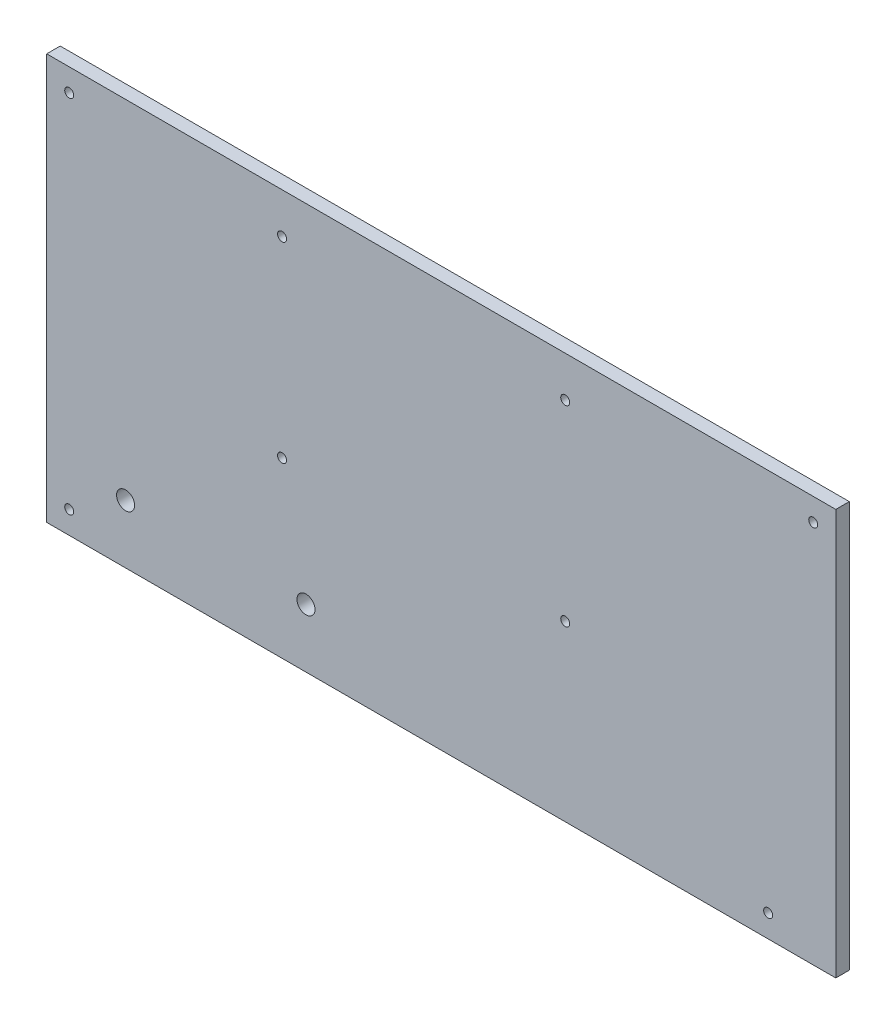
ISO-10303-21;
HEADER;
FILE_DESCRIPTION(('STEP AP214'),'2;1');
FILE_NAME('part.step','',(''),(''),'','','');
FILE_SCHEMA(('AUTOMOTIVE_DESIGN { 1 0 10303 214 1 1 1 1 }'));
ENDSEC;
DATA;
#1=APPLICATION_CONTEXT('core data for automotive mechanical design processes');
#2=APPLICATION_PROTOCOL_DEFINITION('international standard','automotive_design',2000,#1);
#3=PRODUCT_CONTEXT('',#1,'mechanical');
#4=PRODUCT('Part','Part','',(#3));
#5=PRODUCT_RELATED_PRODUCT_CATEGORY('part','',(#4));
#6=PRODUCT_DEFINITION_FORMATION('','',#4);
#7=PRODUCT_DEFINITION_CONTEXT('part definition',#1,'design');
#8=PRODUCT_DEFINITION('design','',#6,#7);
#9=PRODUCT_DEFINITION_SHAPE('','',#8);
#10=(LENGTH_UNIT() NAMED_UNIT(*) SI_UNIT(.MILLI.,.METRE.));
#11=(NAMED_UNIT(*) PLANE_ANGLE_UNIT() SI_UNIT($,.RADIAN.));
#12=(NAMED_UNIT(*) SI_UNIT($,.STERADIAN.) SOLID_ANGLE_UNIT());
#13=UNCERTAINTY_MEASURE_WITH_UNIT(LENGTH_MEASURE(1.E-05),#10,'distance_accuracy_value','');
#14=(GEOMETRIC_REPRESENTATION_CONTEXT(3) GLOBAL_UNCERTAINTY_ASSIGNED_CONTEXT((#13)) GLOBAL_UNIT_ASSIGNED_CONTEXT((#10,
#11,#12)) REPRESENTATION_CONTEXT('',''));
#15=CARTESIAN_POINT('',(0.,0.,0.));
#16=DIRECTION('',(0.,0.,1.));
#17=DIRECTION('',(1.,0.,0.));
#18=AXIS2_PLACEMENT_3D('',#15,#16,#17);
#19=CARTESIAN_POINT('',(175.,0.,6.));
#20=DIRECTION('',(1.,0.,0.));
#21=DIRECTION('',(0.,0.,-1.));
#22=AXIS2_PLACEMENT_3D('',#19,#20,#21);
#23=PLANE('',#22);
#24=DIRECTION('',(0.,-1.,0.));
#25=VECTOR('',#24,1.);
#26=CARTESIAN_POINT('',(175.,0.,0.));
#27=LINE('',#26,#25);
#28=CARTESIAN_POINT('',(175.,90.,0.));
#29=VERTEX_POINT('',#28);
#30=CARTESIAN_POINT('',(175.,-90.,0.));
#31=VERTEX_POINT('',#30);
#32=EDGE_CURVE('E127',#29,#31,#27,.T.);
#33=ORIENTED_EDGE('',*,*,#32,.F.);
#34=DIRECTION('',(0.,0.,-1.));
#35=VECTOR('',#34,1.);
#36=CARTESIAN_POINT('',(175.,90.,6.));
#37=LINE('',#36,#35);
#38=CARTESIAN_POINT('',(175.,90.,6.));
#39=VERTEX_POINT('',#38);
#40=EDGE_CURVE('E11',#39,#29,#37,.T.);
#41=ORIENTED_EDGE('',*,*,#40,.F.);
#42=DIRECTION('',(0.,-1.,0.));
#43=VECTOR('',#42,1.);
#44=CARTESIAN_POINT('',(175.,0.,6.));
#45=LINE('',#44,#43);
#46=CARTESIAN_POINT('',(175.,-90.,6.));
#47=VERTEX_POINT('',#46);
#48=EDGE_CURVE('E101',#39,#47,#45,.T.);
#49=ORIENTED_EDGE('',*,*,#48,.T.);
#50=DIRECTION('',(0.,0.,-1.));
#51=VECTOR('',#50,1.);
#52=CARTESIAN_POINT('',(175.,-90.,6.));
#53=LINE('',#52,#51);
#54=EDGE_CURVE('E79',#47,#31,#53,.T.);
#55=ORIENTED_EDGE('',*,*,#54,.T.);
#56=EDGE_LOOP('',(#33,#41,#49,#55));
#57=FACE_BOUND('',#56,.T.);
#58=ADVANCED_FACE('F37',(#57),#23,.T.);
#59=CARTESIAN_POINT('',(0.,90.,6.));
#60=DIRECTION('',(0.,1.,0.));
#61=DIRECTION('',(-1.,0.,0.));
#62=AXIS2_PLACEMENT_3D('',#59,#60,#61);
#63=PLANE('',#62);
#64=DIRECTION('',(1.,0.,0.));
#65=VECTOR('',#64,1.);
#66=CARTESIAN_POINT('',(0.,90.,0.));
#67=LINE('',#66,#65);
#68=CARTESIAN_POINT('',(-175.,90.,0.));
#69=VERTEX_POINT('',#68);
#70=EDGE_CURVE('E91',#69,#29,#67,.T.);
#71=ORIENTED_EDGE('',*,*,#70,.F.);
#72=DIRECTION('',(0.,0.,-1.));
#73=VECTOR('',#72,1.);
#74=CARTESIAN_POINT('',(-175.,90.,6.));
#75=LINE('',#74,#73);
#76=CARTESIAN_POINT('',(-175.,90.,6.));
#77=VERTEX_POINT('',#76);
#78=EDGE_CURVE('E47',#77,#69,#75,.T.);
#79=ORIENTED_EDGE('',*,*,#78,.F.);
#80=DIRECTION('',(1.,0.,0.));
#81=VECTOR('',#80,1.);
#82=CARTESIAN_POINT('',(0.,90.,6.));
#83=LINE('',#82,#81);
#84=EDGE_CURVE('E89',#77,#39,#83,.T.);
#85=ORIENTED_EDGE('',*,*,#84,.T.);
#86=ORIENTED_EDGE('',*,*,#40,.T.);
#87=EDGE_LOOP('',(#71,#79,#85,#86));
#88=FACE_BOUND('',#87,.T.);
#89=ADVANCED_FACE('F87',(#88),#63,.T.);
#90=CARTESIAN_POINT('',(-175.,0.,6.));
#91=DIRECTION('',(1.,0.,0.));
#92=DIRECTION('',(0.,0.,-1.));
#93=AXIS2_PLACEMENT_3D('',#90,#91,#92);
#94=PLANE('',#93);
#95=DIRECTION('',(0.,-1.,0.));
#96=VECTOR('',#95,1.);
#97=CARTESIAN_POINT('',(-175.,0.,0.));
#98=LINE('',#97,#96);
#99=CARTESIAN_POINT('',(-175.,-90.,0.));
#100=VERTEX_POINT('',#99);
#101=EDGE_CURVE('E130',#69,#100,#98,.T.);
#102=ORIENTED_EDGE('',*,*,#101,.T.);
#103=DIRECTION('',(0.,0.,-1.));
#104=VECTOR('',#103,1.);
#105=CARTESIAN_POINT('',(-175.,-90.,6.));
#106=LINE('',#105,#104);
#107=CARTESIAN_POINT('',(-175.,-90.,6.));
#108=VERTEX_POINT('',#107);
#109=EDGE_CURVE('E94',#108,#100,#106,.T.);
#110=ORIENTED_EDGE('',*,*,#109,.F.);
#111=DIRECTION('',(0.,-1.,0.));
#112=VECTOR('',#111,1.);
#113=CARTESIAN_POINT('',(-175.,0.,6.));
#114=LINE('',#113,#112);
#115=EDGE_CURVE('E97',#77,#108,#114,.T.);
#116=ORIENTED_EDGE('',*,*,#115,.F.);
#117=ORIENTED_EDGE('',*,*,#78,.T.);
#118=EDGE_LOOP('',(#102,#110,#116,#117));
#119=FACE_BOUND('',#118,.T.);
#120=ADVANCED_FACE('F98',(#119),#94,.F.);
#121=CARTESIAN_POINT('',(145.,-80.,6.));
#122=DIRECTION('',(0.,0.,-1.));
#123=DIRECTION('',(-1.,0.,0.));
#124=AXIS2_PLACEMENT_3D('',#121,#122,#123);
#125=CYLINDRICAL_SURFACE('',#124,2.);
#126=CARTESIAN_POINT('',(145.,-80.,6.));
#127=DIRECTION('',(0.,0.,1.));
#128=DIRECTION('',(1.,0.,0.));
#129=AXIS2_PLACEMENT_3D('',#126,#127,#128);
#130=CIRCLE('',#129,2.);
#131=CARTESIAN_POINT('',(147.,-80.,6.));
#132=VERTEX_POINT('',#131);
#133=EDGE_CURVE('E103',#132,#132,#130,.T.);
#134=ORIENTED_EDGE('',*,*,#133,.T.);
#135=EDGE_LOOP('',(#134));
#136=FACE_BOUND('',#135,.T.);
#137=CARTESIAN_POINT('',(145.,-80.,0.));
#138=DIRECTION('',(0.,0.,1.));
#139=DIRECTION('',(1.,0.,0.));
#140=AXIS2_PLACEMENT_3D('',#137,#138,#139);
#141=CIRCLE('',#140,2.);
#142=CARTESIAN_POINT('',(147.,-80.,0.));
#143=VERTEX_POINT('',#142);
#144=EDGE_CURVE('E124',#143,#143,#141,.T.);
#145=ORIENTED_EDGE('',*,*,#144,.F.);
#146=EDGE_LOOP('',(#145));
#147=FACE_BOUND('',#146,.T.);
#148=ADVANCED_FACE('F173',(#136,#147),#125,.F.);
#149=CARTESIAN_POINT('',(165.,80.,6.));
#150=DIRECTION('',(0.,0.,-1.));
#151=DIRECTION('',(-1.,0.,0.));
#152=AXIS2_PLACEMENT_3D('',#149,#150,#151);
#153=CYLINDRICAL_SURFACE('',#152,2.);
#154=CARTESIAN_POINT('',(165.,80.,6.));
#155=DIRECTION('',(0.,0.,1.));
#156=DIRECTION('',(1.,0.,0.));
#157=AXIS2_PLACEMENT_3D('',#154,#155,#156);
#158=CIRCLE('',#157,2.);
#159=CARTESIAN_POINT('',(167.,80.,6.));
#160=VERTEX_POINT('',#159);
#161=EDGE_CURVE('E168',#160,#160,#158,.T.);
#162=ORIENTED_EDGE('',*,*,#161,.T.);
#163=EDGE_LOOP('',(#162));
#164=FACE_BOUND('',#163,.T.);
#165=CARTESIAN_POINT('',(165.,80.,0.));
#166=DIRECTION('',(0.,0.,1.));
#167=DIRECTION('',(1.,0.,0.));
#168=AXIS2_PLACEMENT_3D('',#165,#166,#167);
#169=CIRCLE('',#168,2.);
#170=CARTESIAN_POINT('',(167.,80.,0.));
#171=VERTEX_POINT('',#170);
#172=EDGE_CURVE('E121',#171,#171,#169,.T.);
#173=ORIENTED_EDGE('',*,*,#172,.F.);
#174=EDGE_LOOP('',(#173));
#175=FACE_BOUND('',#174,.T.);
#176=ADVANCED_FACE('F202',(#164,#175),#153,.F.);
#177=CARTESIAN_POINT('',(-165.,80.,6.));
#178=DIRECTION('',(0.,0.,-1.));
#179=DIRECTION('',(-1.,0.,0.));
#180=AXIS2_PLACEMENT_3D('',#177,#178,#179);
#181=CYLINDRICAL_SURFACE('',#180,2.);
#182=CARTESIAN_POINT('',(-165.,80.,6.));
#183=DIRECTION('',(0.,0.,1.));
#184=DIRECTION('',(1.,0.,0.));
#185=AXIS2_PLACEMENT_3D('',#182,#183,#184);
#186=CIRCLE('',#185,2.);
#187=CARTESIAN_POINT('',(-163.,80.,6.));
#188=VERTEX_POINT('',#187);
#189=EDGE_CURVE('E165',#188,#188,#186,.T.);
#190=ORIENTED_EDGE('',*,*,#189,.T.);
#191=EDGE_LOOP('',(#190));
#192=FACE_BOUND('',#191,.T.);
#193=CARTESIAN_POINT('',(-165.,80.,0.));
#194=DIRECTION('',(0.,0.,1.));
#195=DIRECTION('',(1.,0.,0.));
#196=AXIS2_PLACEMENT_3D('',#193,#194,#195);
#197=CIRCLE('',#196,2.);
#198=CARTESIAN_POINT('',(-163.,80.,0.));
#199=VERTEX_POINT('',#198);
#200=EDGE_CURVE('E118',#199,#199,#197,.T.);
#201=ORIENTED_EDGE('',*,*,#200,.F.);
#202=EDGE_LOOP('',(#201));
#203=FACE_BOUND('',#202,.T.);
#204=ADVANCED_FACE('F205',(#192,#203),#181,.F.);
#205=CARTESIAN_POINT('',(-165.,-80.,6.));
#206=DIRECTION('',(0.,0.,-1.));
#207=DIRECTION('',(-1.,0.,0.));
#208=AXIS2_PLACEMENT_3D('',#205,#206,#207);
#209=CYLINDRICAL_SURFACE('',#208,2.);
#210=CARTESIAN_POINT('',(-165.,-80.,6.));
#211=DIRECTION('',(0.,0.,1.));
#212=DIRECTION('',(1.,0.,0.));
#213=AXIS2_PLACEMENT_3D('',#210,#211,#212);
#214=CIRCLE('',#213,2.);
#215=CARTESIAN_POINT('',(-163.,-80.,6.));
#216=VERTEX_POINT('',#215);
#217=EDGE_CURVE('E162',#216,#216,#214,.T.);
#218=ORIENTED_EDGE('',*,*,#217,.T.);
#219=EDGE_LOOP('',(#218));
#220=FACE_BOUND('',#219,.T.);
#221=CARTESIAN_POINT('',(-165.,-80.,0.));
#222=DIRECTION('',(0.,0.,1.));
#223=DIRECTION('',(1.,0.,0.));
#224=AXIS2_PLACEMENT_3D('',#221,#222,#223);
#225=CIRCLE('',#224,2.);
#226=CARTESIAN_POINT('',(-163.,-80.,0.));
#227=VERTEX_POINT('',#226);
#228=EDGE_CURVE('E115',#227,#227,#225,.T.);
#229=ORIENTED_EDGE('',*,*,#228,.F.);
#230=EDGE_LOOP('',(#229));
#231=FACE_BOUND('',#230,.T.);
#232=ADVANCED_FACE('F209',(#220,#231),#209,.F.);
#233=CARTESIAN_POINT('',(-140.,-64.,6.));
#234=DIRECTION('',(0.,0.,-1.));
#235=DIRECTION('',(-1.,0.,0.));
#236=AXIS2_PLACEMENT_3D('',#233,#234,#235);
#237=CYLINDRICAL_SURFACE('',#236,3.99999999999999);
#238=CARTESIAN_POINT('',(-140.,-64.,6.));
#239=DIRECTION('',(0.,0.,1.));
#240=DIRECTION('',(1.,0.,0.));
#241=AXIS2_PLACEMENT_3D('',#238,#239,#240);
#242=CIRCLE('',#241,3.99999999999999);
#243=CARTESIAN_POINT('',(-136.,-64.,6.));
#244=VERTEX_POINT('',#243);
#245=EDGE_CURVE('E159',#244,#244,#242,.T.);
#246=ORIENTED_EDGE('',*,*,#245,.T.);
#247=EDGE_LOOP('',(#246));
#248=FACE_BOUND('',#247,.T.);
#249=CARTESIAN_POINT('',(-140.,-64.,0.));
#250=DIRECTION('',(0.,0.,1.));
#251=DIRECTION('',(1.,0.,0.));
#252=AXIS2_PLACEMENT_3D('',#249,#250,#251);
#253=CIRCLE('',#252,3.99999999999999);
#254=CARTESIAN_POINT('',(-136.,-64.,0.));
#255=VERTEX_POINT('',#254);
#256=EDGE_CURVE('E111',#255,#255,#253,.T.);
#257=ORIENTED_EDGE('',*,*,#256,.F.);
#258=EDGE_LOOP('',(#257));
#259=FACE_BOUND('',#258,.T.);
#260=ADVANCED_FACE('F212',(#248,#259),#237,.F.);
#261=CARTESIAN_POINT('',(-60.,-64.,6.));
#262=DIRECTION('',(0.,0.,-1.));
#263=DIRECTION('',(-1.,0.,0.));
#264=AXIS2_PLACEMENT_3D('',#261,#262,#263);
#265=CYLINDRICAL_SURFACE('',#264,4.00000000000001);
#266=CARTESIAN_POINT('',(-60.,-64.,6.));
#267=DIRECTION('',(0.,0.,1.));
#268=DIRECTION('',(1.,0.,0.));
#269=AXIS2_PLACEMENT_3D('',#266,#267,#268);
#270=CIRCLE('',#269,4.00000000000001);
#271=CARTESIAN_POINT('',(-56.,-64.,6.));
#272=VERTEX_POINT('',#271);
#273=EDGE_CURVE('E133',#272,#272,#270,.T.);
#274=ORIENTED_EDGE('',*,*,#273,.T.);
#275=EDGE_LOOP('',(#274));
#276=FACE_BOUND('',#275,.T.);
#277=CARTESIAN_POINT('',(-60.,-64.,0.));
#278=DIRECTION('',(0.,0.,1.));
#279=DIRECTION('',(1.,0.,0.));
#280=AXIS2_PLACEMENT_3D('',#277,#278,#279);
#281=CIRCLE('',#280,4.00000000000001);
#282=CARTESIAN_POINT('',(-56.,-64.,0.));
#283=VERTEX_POINT('',#282);
#284=EDGE_CURVE('E108',#283,#283,#281,.T.);
#285=ORIENTED_EDGE('',*,*,#284,.F.);
#286=EDGE_LOOP('',(#285));
#287=FACE_BOUND('',#286,.T.);
#288=ADVANCED_FACE('F39',(#276,#287),#265,.F.);
#289=CARTESIAN_POINT('',(0.,-90.,6.));
#290=DIRECTION('',(0.,1.,0.));
#291=DIRECTION('',(-1.,0.,0.));
#292=AXIS2_PLACEMENT_3D('',#289,#290,#291);
#293=PLANE('',#292);
#294=DIRECTION('',(1.,0.,0.));
#295=VECTOR('',#294,1.);
#296=CARTESIAN_POINT('',(0.,-90.,0.));
#297=LINE('',#296,#295);
#298=EDGE_CURVE('E72',#100,#31,#297,.T.);
#299=ORIENTED_EDGE('',*,*,#298,.T.);
#300=ORIENTED_EDGE('',*,*,#54,.F.);
#301=DIRECTION('',(1.,0.,0.));
#302=VECTOR('',#301,1.);
#303=CARTESIAN_POINT('',(0.,-90.,6.));
#304=LINE('',#303,#302);
#305=EDGE_CURVE('E56',#108,#47,#304,.T.);
#306=ORIENTED_EDGE('',*,*,#305,.F.);
#307=ORIENTED_EDGE('',*,*,#109,.T.);
#308=EDGE_LOOP('',(#299,#300,#306,#307));
#309=FACE_BOUND('',#308,.T.);
#310=ADVANCED_FACE('F178',(#309),#293,.F.);
#311=CARTESIAN_POINT('',(0.,0.,6.));
#312=DIRECTION('',(0.,0.,1.));
#313=DIRECTION('',(1.,0.,0.));
#314=AXIS2_PLACEMENT_3D('',#311,#312,#313);
#315=PLANE('',#314);
#316=CARTESIAN_POINT('',(-70.6000000000001,72.,6.));
#317=DIRECTION('',(0.,0.,1.));
#318=DIRECTION('',(1.,0.,0.));
#319=AXIS2_PLACEMENT_3D('',#316,#317,#318);
#320=CIRCLE('',#319,2.00000000000001);
#321=CARTESIAN_POINT('',(-68.6,72.,6.));
#322=VERTEX_POINT('',#321);
#323=EDGE_CURVE('E142',#322,#322,#320,.T.);
#324=ORIENTED_EDGE('',*,*,#323,.F.);
#325=EDGE_LOOP('',(#324));
#326=FACE_BOUND('',#325,.T.);
#327=CARTESIAN_POINT('',(-70.6000000000001,-13.,6.));
#328=DIRECTION('',(0.,0.,1.));
#329=DIRECTION('',(1.,0.,0.));
#330=AXIS2_PLACEMENT_3D('',#327,#328,#329);
#331=CIRCLE('',#330,2.);
#332=CARTESIAN_POINT('',(-68.6000000000001,-13.,6.));
#333=VERTEX_POINT('',#332);
#334=EDGE_CURVE('E308',#333,#333,#331,.T.);
#335=ORIENTED_EDGE('',*,*,#334,.F.);
#336=EDGE_LOOP('',(#335));
#337=FACE_BOUND('',#336,.T.);
#338=CARTESIAN_POINT('',(54.9999999999999,-13.,6.));
#339=DIRECTION('',(0.,0.,1.));
#340=DIRECTION('',(1.,0.,0.));
#341=AXIS2_PLACEMENT_3D('',#338,#339,#340);
#342=CIRCLE('',#341,2.);
#343=CARTESIAN_POINT('',(56.9999999999999,-13.,6.));
#344=VERTEX_POINT('',#343);
#345=EDGE_CURVE('E155',#344,#344,#342,.T.);
#346=ORIENTED_EDGE('',*,*,#345,.F.);
#347=EDGE_LOOP('',(#346));
#348=FACE_BOUND('',#347,.T.);
#349=CARTESIAN_POINT('',(54.9999999999999,72.,6.));
#350=DIRECTION('',(0.,0.,1.));
#351=DIRECTION('',(1.,0.,0.));
#352=AXIS2_PLACEMENT_3D('',#349,#350,#351);
#353=CIRCLE('',#352,2.);
#354=CARTESIAN_POINT('',(56.9999999999999,72.,6.));
#355=VERTEX_POINT('',#354);
#356=EDGE_CURVE('E138',#355,#355,#353,.T.);
#357=ORIENTED_EDGE('',*,*,#356,.F.);
#358=EDGE_LOOP('',(#357));
#359=FACE_BOUND('',#358,.T.);
#360=ORIENTED_EDGE('',*,*,#273,.F.);
#361=EDGE_LOOP('',(#360));
#362=FACE_BOUND('',#361,.T.);
#363=ORIENTED_EDGE('',*,*,#245,.F.);
#364=EDGE_LOOP('',(#363));
#365=FACE_BOUND('',#364,.T.);
#366=ORIENTED_EDGE('',*,*,#217,.F.);
#367=EDGE_LOOP('',(#366));
#368=FACE_BOUND('',#367,.T.);
#369=ORIENTED_EDGE('',*,*,#189,.F.);
#370=EDGE_LOOP('',(#369));
#371=FACE_BOUND('',#370,.T.);
#372=ORIENTED_EDGE('',*,*,#161,.F.);
#373=EDGE_LOOP('',(#372));
#374=FACE_BOUND('',#373,.T.);
#375=ORIENTED_EDGE('',*,*,#133,.F.);
#376=EDGE_LOOP('',(#375));
#377=FACE_BOUND('',#376,.T.);
#378=ORIENTED_EDGE('',*,*,#48,.F.);
#379=ORIENTED_EDGE('',*,*,#84,.F.);
#380=ORIENTED_EDGE('',*,*,#115,.T.);
#381=ORIENTED_EDGE('',*,*,#305,.T.);
#382=EDGE_LOOP('',(#378,#379,#380,#381));
#383=FACE_BOUND('',#382,.T.);
#384=ADVANCED_FACE('F100',(#326,#337,#348,#359,#362,#365,#368,#371,#374,#377,#383),#315,.T.);
#385=CARTESIAN_POINT('',(0.,0.,0.));
#386=DIRECTION('',(0.,0.,1.));
#387=DIRECTION('',(1.,0.,0.));
#388=AXIS2_PLACEMENT_3D('',#385,#386,#387);
#389=PLANE('',#388);
#390=CARTESIAN_POINT('',(-70.6000000000001,72.,0.));
#391=DIRECTION('',(0.,0.,1.));
#392=DIRECTION('',(1.,0.,0.));
#393=AXIS2_PLACEMENT_3D('',#390,#391,#392);
#394=CIRCLE('',#393,2.00000000000001);
#395=CARTESIAN_POINT('',(-68.6,72.,0.));
#396=VERTEX_POINT('',#395);
#397=EDGE_CURVE('E41',#396,#396,#394,.T.);
#398=ORIENTED_EDGE('',*,*,#397,.T.);
#399=EDGE_LOOP('',(#398));
#400=FACE_BOUND('',#399,.T.);
#401=CARTESIAN_POINT('',(-70.6000000000001,-13.,0.));
#402=DIRECTION('',(0.,0.,1.));
#403=DIRECTION('',(1.,0.,0.));
#404=AXIS2_PLACEMENT_3D('',#401,#402,#403);
#405=CIRCLE('',#404,2.);
#406=CARTESIAN_POINT('',(-68.6000000000001,-13.,0.));
#407=VERTEX_POINT('',#406);
#408=EDGE_CURVE('E141',#407,#407,#405,.T.);
#409=ORIENTED_EDGE('',*,*,#408,.T.);
#410=EDGE_LOOP('',(#409));
#411=FACE_BOUND('',#410,.T.);
#412=CARTESIAN_POINT('',(54.9999999999999,-13.,0.));
#413=DIRECTION('',(0.,0.,1.));
#414=DIRECTION('',(1.,0.,0.));
#415=AXIS2_PLACEMENT_3D('',#412,#413,#414);
#416=CIRCLE('',#415,2.);
#417=CARTESIAN_POINT('',(56.9999999999999,-13.,0.));
#418=VERTEX_POINT('',#417);
#419=EDGE_CURVE('E139',#418,#418,#416,.T.);
#420=ORIENTED_EDGE('',*,*,#419,.T.);
#421=EDGE_LOOP('',(#420));
#422=FACE_BOUND('',#421,.T.);
#423=CARTESIAN_POINT('',(54.9999999999999,72.,0.));
#424=DIRECTION('',(0.,0.,1.));
#425=DIRECTION('',(1.,0.,0.));
#426=AXIS2_PLACEMENT_3D('',#423,#424,#425);
#427=CIRCLE('',#426,2.);
#428=CARTESIAN_POINT('',(56.9999999999999,72.,0.));
#429=VERTEX_POINT('',#428);
#430=EDGE_CURVE('E112',#429,#429,#427,.T.);
#431=ORIENTED_EDGE('',*,*,#430,.T.);
#432=EDGE_LOOP('',(#431));
#433=FACE_BOUND('',#432,.T.);
#434=ORIENTED_EDGE('',*,*,#284,.T.);
#435=EDGE_LOOP('',(#434));
#436=FACE_BOUND('',#435,.T.);
#437=ORIENTED_EDGE('',*,*,#256,.T.);
#438=EDGE_LOOP('',(#437));
#439=FACE_BOUND('',#438,.T.);
#440=ORIENTED_EDGE('',*,*,#228,.T.);
#441=EDGE_LOOP('',(#440));
#442=FACE_BOUND('',#441,.T.);
#443=ORIENTED_EDGE('',*,*,#200,.T.);
#444=EDGE_LOOP('',(#443));
#445=FACE_BOUND('',#444,.T.);
#446=ORIENTED_EDGE('',*,*,#172,.T.);
#447=EDGE_LOOP('',(#446));
#448=FACE_BOUND('',#447,.T.);
#449=ORIENTED_EDGE('',*,*,#144,.T.);
#450=EDGE_LOOP('',(#449));
#451=FACE_BOUND('',#450,.T.);
#452=ORIENTED_EDGE('',*,*,#32,.T.);
#453=ORIENTED_EDGE('',*,*,#298,.F.);
#454=ORIENTED_EDGE('',*,*,#101,.F.);
#455=ORIENTED_EDGE('',*,*,#70,.T.);
#456=EDGE_LOOP('',(#452,#453,#454,#455));
#457=FACE_BOUND('',#456,.T.);
#458=ADVANCED_FACE('F177',(#400,#411,#422,#433,#436,#439,#442,#445,#448,#451,#457),#389,.F.);
#459=CARTESIAN_POINT('',(54.9999999999999,72.,-4.));
#460=DIRECTION('',(0.,0.,1.));
#461=DIRECTION('',(1.,0.,0.));
#462=AXIS2_PLACEMENT_3D('',#459,#460,#461);
#463=CYLINDRICAL_SURFACE('',#462,2.);
#464=ORIENTED_EDGE('',*,*,#356,.T.);
#465=EDGE_LOOP('',(#464));
#466=FACE_BOUND('',#465,.T.);
#467=ORIENTED_EDGE('',*,*,#430,.F.);
#468=EDGE_LOOP('',(#467));
#469=FACE_BOUND('',#468,.T.);
#470=ADVANCED_FACE('F185',(#466,#469),#463,.F.);
#471=CARTESIAN_POINT('',(54.9999999999999,-13.,-4.));
#472=DIRECTION('',(0.,0.,1.));
#473=DIRECTION('',(1.,0.,0.));
#474=AXIS2_PLACEMENT_3D('',#471,#472,#473);
#475=CYLINDRICAL_SURFACE('',#474,2.);
#476=ORIENTED_EDGE('',*,*,#345,.T.);
#477=EDGE_LOOP('',(#476));
#478=FACE_BOUND('',#477,.T.);
#479=ORIENTED_EDGE('',*,*,#419,.F.);
#480=EDGE_LOOP('',(#479));
#481=FACE_BOUND('',#480,.T.);
#482=ADVANCED_FACE('F274',(#478,#481),#475,.F.);
#483=CARTESIAN_POINT('',(-70.6000000000001,-13.,-4.));
#484=DIRECTION('',(0.,0.,1.));
#485=DIRECTION('',(1.,0.,0.));
#486=AXIS2_PLACEMENT_3D('',#483,#484,#485);
#487=CYLINDRICAL_SURFACE('',#486,2.);
#488=ORIENTED_EDGE('',*,*,#334,.T.);
#489=EDGE_LOOP('',(#488));
#490=FACE_BOUND('',#489,.T.);
#491=ORIENTED_EDGE('',*,*,#408,.F.);
#492=EDGE_LOOP('',(#491));
#493=FACE_BOUND('',#492,.T.);
#494=ADVANCED_FACE('F282',(#490,#493),#487,.F.);
#495=CARTESIAN_POINT('',(-70.6000000000001,72.,-4.));
#496=DIRECTION('',(0.,0.,1.));
#497=DIRECTION('',(1.,0.,0.));
#498=AXIS2_PLACEMENT_3D('',#495,#496,#497);
#499=CYLINDRICAL_SURFACE('',#498,2.00000000000001);
#500=ORIENTED_EDGE('',*,*,#323,.T.);
#501=EDGE_LOOP('',(#500));
#502=FACE_BOUND('',#501,.T.);
#503=ORIENTED_EDGE('',*,*,#397,.F.);
#504=EDGE_LOOP('',(#503));
#505=FACE_BOUND('',#504,.T.);
#506=ADVANCED_FACE('F292',(#502,#505),#499,.F.);
#507=CLOSED_SHELL('',(#58,#89,#120,#148,#176,#204,#232,#260,#288,#310,#384,#458,#470,#482,#494,#506));
#508=MANIFOLD_SOLID_BREP('B2',#507);
#509=ADVANCED_BREP_SHAPE_REPRESENTATION('',(#18,#508),#14);
#510=SHAPE_DEFINITION_REPRESENTATION(#9,#509);
ENDSEC;
END-ISO-10303-21;
